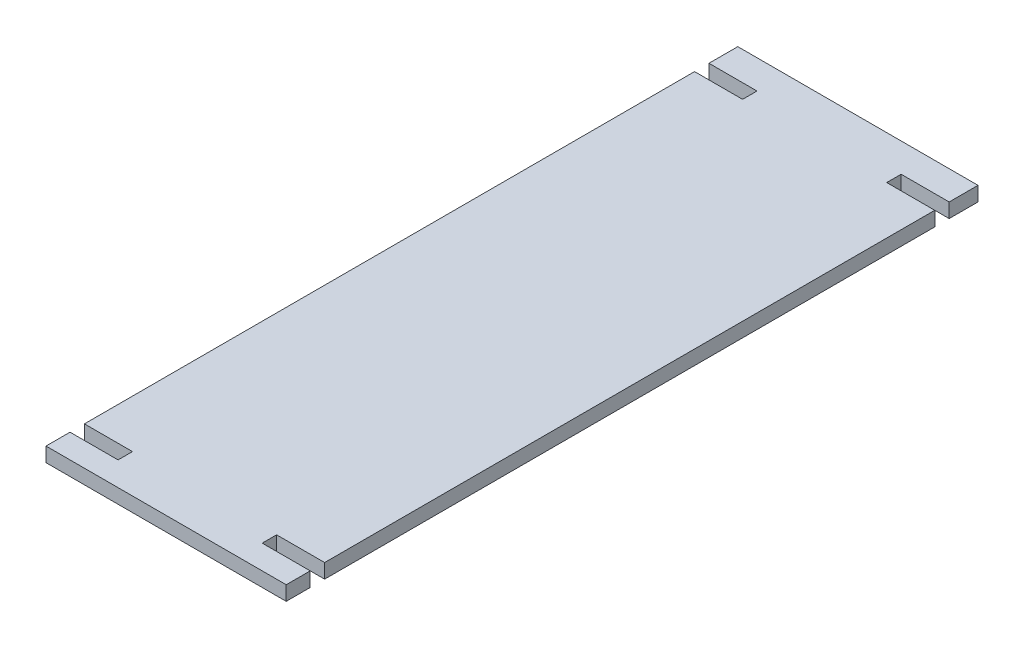
ISO-10303-21;
HEADER;
FILE_DESCRIPTION(('STEP AP214'),'2;1');
FILE_NAME('part.step','',(''),(''),'','','');
FILE_SCHEMA(('AUTOMOTIVE_DESIGN { 1 0 10303 214 1 1 1 1 }'));
ENDSEC;
DATA;
#1=APPLICATION_CONTEXT('core data for automotive mechanical design processes');
#2=APPLICATION_PROTOCOL_DEFINITION('international standard','automotive_design',2000,#1);
#3=PRODUCT_CONTEXT('',#1,'mechanical');
#4=PRODUCT('Part','Part','',(#3));
#5=PRODUCT_RELATED_PRODUCT_CATEGORY('part','',(#4));
#6=PRODUCT_DEFINITION_FORMATION('','',#4);
#7=PRODUCT_DEFINITION_CONTEXT('part definition',#1,'design');
#8=PRODUCT_DEFINITION('design','',#6,#7);
#9=PRODUCT_DEFINITION_SHAPE('','',#8);
#10=(LENGTH_UNIT() NAMED_UNIT(*) SI_UNIT(.MILLI.,.METRE.));
#11=(NAMED_UNIT(*) PLANE_ANGLE_UNIT() SI_UNIT($,.RADIAN.));
#12=(NAMED_UNIT(*) SI_UNIT($,.STERADIAN.) SOLID_ANGLE_UNIT());
#13=UNCERTAINTY_MEASURE_WITH_UNIT(LENGTH_MEASURE(1.E-05),#10,'distance_accuracy_value','');
#14=(GEOMETRIC_REPRESENTATION_CONTEXT(3) GLOBAL_UNCERTAINTY_ASSIGNED_CONTEXT((#13)) GLOBAL_UNIT_ASSIGNED_CONTEXT((#10,
#11,#12)) REPRESENTATION_CONTEXT('',''));
#15=CARTESIAN_POINT('',(0.,0.,0.));
#16=DIRECTION('',(0.,0.,1.));
#17=DIRECTION('',(1.,0.,0.));
#18=AXIS2_PLACEMENT_3D('',#15,#16,#17);
#19=CARTESIAN_POINT('',(0.,6.,0.));
#20=DIRECTION('',(-1.,0.,0.));
#21=DIRECTION('',(0.,0.,1.));
#22=AXIS2_PLACEMENT_3D('',#19,#20,#21);
#23=PLANE('',#22);
#24=DIRECTION('',(0.,0.,-1.));
#25=VECTOR('',#24,1.);
#26=CARTESIAN_POINT('',(0.,6.,0.));
#27=LINE('',#26,#25);
#28=CARTESIAN_POINT('',(0.,6.,-276.));
#29=VERTEX_POINT('',#28);
#30=CARTESIAN_POINT('',(0.,6.,-288.));
#31=VERTEX_POINT('',#30);
#32=EDGE_CURVE('E339',#29,#31,#27,.T.);
#33=ORIENTED_EDGE('',*,*,#32,.F.);
#34=DIRECTION('',(0.,1.,0.));
#35=VECTOR('',#34,1.);
#36=CARTESIAN_POINT('',(0.,0.,-276.));
#37=LINE('',#36,#35);
#38=CARTESIAN_POINT('',(0.,0.,-276.));
#39=VERTEX_POINT('',#38);
#40=EDGE_CURVE('E223',#39,#29,#37,.T.);
#41=ORIENTED_EDGE('',*,*,#40,.F.);
#42=DIRECTION('',(0.,0.,-1.));
#43=VECTOR('',#42,1.);
#44=CARTESIAN_POINT('',(0.,0.,0.));
#45=LINE('',#44,#43);
#46=CARTESIAN_POINT('',(0.,0.,-288.));
#47=VERTEX_POINT('',#46);
#48=EDGE_CURVE('E324',#39,#47,#45,.T.);
#49=ORIENTED_EDGE('',*,*,#48,.T.);
#50=DIRECTION('',(0.,-1.,0.));
#51=VECTOR('',#50,1.);
#52=CARTESIAN_POINT('',(0.,6.,-288.));
#53=LINE('',#52,#51);
#54=EDGE_CURVE('E11',#31,#47,#53,.T.);
#55=ORIENTED_EDGE('',*,*,#54,.F.);
#56=EDGE_LOOP('',(#33,#41,#49,#55));
#57=FACE_BOUND('',#56,.T.);
#58=ADVANCED_FACE('F45',(#57),#23,.F.);
#59=CARTESIAN_POINT('',(0.,0.,-16.));
#60=VERTEX_POINT('',#59);
#61=CARTESIAN_POINT('',(0.,0.,-270.));
#62=VERTEX_POINT('',#61);
#63=EDGE_CURVE('E357',#60,#62,#45,.T.);
#64=ORIENTED_EDGE('',*,*,#63,.T.);
#65=DIRECTION('',(0.,1.,0.));
#66=VECTOR('',#65,1.);
#67=CARTESIAN_POINT('',(0.,0.,-270.));
#68=LINE('',#67,#66);
#69=CARTESIAN_POINT('',(0.,6.,-270.));
#70=VERTEX_POINT('',#69);
#71=EDGE_CURVE('E69',#62,#70,#68,.T.);
#72=ORIENTED_EDGE('',*,*,#71,.T.);
#73=CARTESIAN_POINT('',(0.,6.,-16.));
#74=VERTEX_POINT('',#73);
#75=EDGE_CURVE('E338',#74,#70,#27,.T.);
#76=ORIENTED_EDGE('',*,*,#75,.F.);
#77=DIRECTION('',(0.,1.,0.));
#78=VECTOR('',#77,1.);
#79=CARTESIAN_POINT('',(0.,0.,-16.));
#80=LINE('',#79,#78);
#81=EDGE_CURVE('E288',#60,#74,#80,.T.);
#82=ORIENTED_EDGE('',*,*,#81,.F.);
#83=EDGE_LOOP('',(#64,#72,#76,#82));
#84=FACE_BOUND('',#83,.T.);
#85=ADVANCED_FACE('F402',(#84),#23,.F.);
#86=CARTESIAN_POINT('',(-100.,6.,0.));
#87=DIRECTION('',(1.,0.,0.));
#88=DIRECTION('',(0.,0.,-1.));
#89=AXIS2_PLACEMENT_3D('',#86,#87,#88);
#90=PLANE('',#89);
#91=DIRECTION('',(0.,0.,1.));
#92=VECTOR('',#91,1.);
#93=CARTESIAN_POINT('',(-100.,0.,0.));
#94=LINE('',#93,#92);
#95=CARTESIAN_POINT('',(-100.,0.,-270.));
#96=VERTEX_POINT('',#95);
#97=CARTESIAN_POINT('',(-100.,0.,-16.));
#98=VERTEX_POINT('',#97);
#99=EDGE_CURVE('E366',#96,#98,#94,.T.);
#100=ORIENTED_EDGE('',*,*,#99,.T.);
#101=DIRECTION('',(0.,1.,0.));
#102=VECTOR('',#101,1.);
#103=CARTESIAN_POINT('',(-100.,0.,-16.));
#104=LINE('',#103,#102);
#105=CARTESIAN_POINT('',(-100.,6.,-16.));
#106=VERTEX_POINT('',#105);
#107=EDGE_CURVE('E216',#98,#106,#104,.T.);
#108=ORIENTED_EDGE('',*,*,#107,.T.);
#109=DIRECTION('',(0.,0.,1.));
#110=VECTOR('',#109,1.);
#111=CARTESIAN_POINT('',(-100.,6.,0.));
#112=LINE('',#111,#110);
#113=CARTESIAN_POINT('',(-100.,6.,-270.));
#114=VERTEX_POINT('',#113);
#115=EDGE_CURVE('E348',#114,#106,#112,.T.);
#116=ORIENTED_EDGE('',*,*,#115,.F.);
#117=DIRECTION('',(0.,1.,0.));
#118=VECTOR('',#117,1.);
#119=CARTESIAN_POINT('',(-100.,0.,-270.));
#120=LINE('',#119,#118);
#121=EDGE_CURVE('E310',#96,#114,#120,.T.);
#122=ORIENTED_EDGE('',*,*,#121,.F.);
#123=EDGE_LOOP('',(#100,#108,#116,#122));
#124=FACE_BOUND('',#123,.T.);
#125=ADVANCED_FACE('F434',(#124),#90,.F.);
#126=CARTESIAN_POINT('',(-100.,0.,-288.));
#127=VERTEX_POINT('',#126);
#128=CARTESIAN_POINT('',(-100.,0.,-276.));
#129=VERTEX_POINT('',#128);
#130=EDGE_CURVE('E361',#127,#129,#94,.T.);
#131=ORIENTED_EDGE('',*,*,#130,.T.);
#132=DIRECTION('',(0.,1.,0.));
#133=VECTOR('',#132,1.);
#134=CARTESIAN_POINT('',(-100.,0.,-276.));
#135=LINE('',#134,#133);
#136=CARTESIAN_POINT('',(-100.,6.,-276.));
#137=VERTEX_POINT('',#136);
#138=EDGE_CURVE('E320',#129,#137,#135,.T.);
#139=ORIENTED_EDGE('',*,*,#138,.T.);
#140=CARTESIAN_POINT('',(-100.,6.,-288.));
#141=VERTEX_POINT('',#140);
#142=EDGE_CURVE('E343',#141,#137,#112,.T.);
#143=ORIENTED_EDGE('',*,*,#142,.F.);
#144=DIRECTION('',(0.,-1.,0.));
#145=VECTOR('',#144,1.);
#146=CARTESIAN_POINT('',(-100.,6.,-288.));
#147=LINE('',#146,#145);
#148=EDGE_CURVE('E54',#141,#127,#147,.T.);
#149=ORIENTED_EDGE('',*,*,#148,.T.);
#150=EDGE_LOOP('',(#131,#139,#143,#149));
#151=FACE_BOUND('',#150,.T.);
#152=ADVANCED_FACE('F381',(#151),#90,.F.);
#153=CARTESIAN_POINT('',(0.,0.,0.));
#154=VERTEX_POINT('',#153);
#155=CARTESIAN_POINT('',(0.,0.,-9.99999999999995));
#156=VERTEX_POINT('',#155);
#157=EDGE_CURVE('E352',#154,#156,#45,.T.);
#158=ORIENTED_EDGE('',*,*,#157,.T.);
#159=DIRECTION('',(0.,1.,0.));
#160=VECTOR('',#159,1.);
#161=CARTESIAN_POINT('',(0.,0.,-9.99999999999995));
#162=LINE('',#161,#160);
#163=CARTESIAN_POINT('',(0.,6.,-9.99999999999995));
#164=VERTEX_POINT('',#163);
#165=EDGE_CURVE('E291',#156,#164,#162,.T.);
#166=ORIENTED_EDGE('',*,*,#165,.T.);
#167=CARTESIAN_POINT('',(0.,6.,0.));
#168=VERTEX_POINT('',#167);
#169=EDGE_CURVE('E333',#168,#164,#27,.T.);
#170=ORIENTED_EDGE('',*,*,#169,.F.);
#171=DIRECTION('',(0.,-1.,0.));
#172=VECTOR('',#171,1.);
#173=CARTESIAN_POINT('',(0.,6.,0.));
#174=LINE('',#173,#172);
#175=EDGE_CURVE('E351',#168,#154,#174,.T.);
#176=ORIENTED_EDGE('',*,*,#175,.T.);
#177=EDGE_LOOP('',(#158,#166,#170,#176));
#178=FACE_BOUND('',#177,.T.);
#179=ADVANCED_FACE('F47',(#178),#23,.F.);
#180=CARTESIAN_POINT('',(0.,6.,-288.));
#181=DIRECTION('',(0.,0.,1.));
#182=DIRECTION('',(1.,0.,0.));
#183=AXIS2_PLACEMENT_3D('',#180,#181,#182);
#184=PLANE('',#183);
#185=DIRECTION('',(-1.,0.,0.));
#186=VECTOR('',#185,1.);
#187=CARTESIAN_POINT('',(0.,0.,-288.));
#188=LINE('',#187,#186);
#189=EDGE_CURVE('E356',#47,#127,#188,.T.);
#190=ORIENTED_EDGE('',*,*,#189,.T.);
#191=ORIENTED_EDGE('',*,*,#148,.F.);
#192=DIRECTION('',(-1.,0.,0.));
#193=VECTOR('',#192,1.);
#194=CARTESIAN_POINT('',(0.,6.,-288.));
#195=LINE('',#194,#193);
#196=EDGE_CURVE('E337',#31,#141,#195,.T.);
#197=ORIENTED_EDGE('',*,*,#196,.F.);
#198=ORIENTED_EDGE('',*,*,#54,.T.);
#199=EDGE_LOOP('',(#190,#191,#197,#198));
#200=FACE_BOUND('',#199,.T.);
#201=ADVANCED_FACE('F395',(#200),#184,.F.);
#202=CARTESIAN_POINT('',(-100.,6.,-9.99999999999995));
#203=VERTEX_POINT('',#202);
#204=CARTESIAN_POINT('',(-100.,6.,0.));
#205=VERTEX_POINT('',#204);
#206=EDGE_CURVE('E342',#203,#205,#112,.T.);
#207=ORIENTED_EDGE('',*,*,#206,.F.);
#208=DIRECTION('',(0.,1.,0.));
#209=VECTOR('',#208,1.);
#210=CARTESIAN_POINT('',(-100.,0.,-9.99999999999995));
#211=LINE('',#210,#209);
#212=CARTESIAN_POINT('',(-100.,0.,-9.99999999999995));
#213=VERTEX_POINT('',#212);
#214=EDGE_CURVE('E239',#213,#203,#211,.T.);
#215=ORIENTED_EDGE('',*,*,#214,.F.);
#216=CARTESIAN_POINT('',(-100.,0.,0.));
#217=VERTEX_POINT('',#216);
#218=EDGE_CURVE('E360',#213,#217,#94,.T.);
#219=ORIENTED_EDGE('',*,*,#218,.T.);
#220=DIRECTION('',(0.,-1.,0.));
#221=VECTOR('',#220,1.);
#222=CARTESIAN_POINT('',(-100.,6.,0.));
#223=LINE('',#222,#221);
#224=EDGE_CURVE('E372',#205,#217,#223,.T.);
#225=ORIENTED_EDGE('',*,*,#224,.F.);
#226=EDGE_LOOP('',(#207,#215,#219,#225));
#227=FACE_BOUND('',#226,.T.);
#228=ADVANCED_FACE('F447',(#227),#90,.F.);
#229=CARTESIAN_POINT('',(0.,6.,0.));
#230=DIRECTION('',(0.,0.,-1.));
#231=DIRECTION('',(-1.,0.,0.));
#232=AXIS2_PLACEMENT_3D('',#229,#230,#231);
#233=PLANE('',#232);
#234=DIRECTION('',(1.,0.,0.));
#235=VECTOR('',#234,1.);
#236=CARTESIAN_POINT('',(0.,0.,0.));
#237=LINE('',#236,#235);
#238=EDGE_CURVE('E365',#217,#154,#237,.T.);
#239=ORIENTED_EDGE('',*,*,#238,.T.);
#240=ORIENTED_EDGE('',*,*,#175,.F.);
#241=DIRECTION('',(1.,0.,0.));
#242=VECTOR('',#241,1.);
#243=CARTESIAN_POINT('',(0.,6.,0.));
#244=LINE('',#243,#242);
#245=EDGE_CURVE('E347',#205,#168,#244,.T.);
#246=ORIENTED_EDGE('',*,*,#245,.F.);
#247=ORIENTED_EDGE('',*,*,#224,.T.);
#248=EDGE_LOOP('',(#239,#240,#246,#247));
#249=FACE_BOUND('',#248,.T.);
#250=ADVANCED_FACE('F423',(#249),#233,.F.);
#251=CARTESIAN_POINT('',(0.,6.,0.));
#252=DIRECTION('',(0.,1.,0.));
#253=DIRECTION('',(0.,0.,1.));
#254=AXIS2_PLACEMENT_3D('',#251,#252,#253);
#255=PLANE('',#254);
#256=DIRECTION('',(-1.,0.,0.));
#257=VECTOR('',#256,1.);
#258=CARTESIAN_POINT('',(-20.,6.,-276.));
#259=LINE('',#258,#257);
#260=CARTESIAN_POINT('',(-20.,6.,-276.));
#261=VERTEX_POINT('',#260);
#262=EDGE_CURVE('E205',#29,#261,#259,.T.);
#263=ORIENTED_EDGE('',*,*,#262,.F.);
#264=ORIENTED_EDGE('',*,*,#32,.T.);
#265=ORIENTED_EDGE('',*,*,#196,.T.);
#266=ORIENTED_EDGE('',*,*,#142,.T.);
#267=DIRECTION('',(-1.,0.,0.));
#268=VECTOR('',#267,1.);
#269=CARTESIAN_POINT('',(-100.,6.,-276.));
#270=LINE('',#269,#268);
#271=CARTESIAN_POINT('',(-80.,6.,-276.));
#272=VERTEX_POINT('',#271);
#273=EDGE_CURVE('E302',#272,#137,#270,.T.);
#274=ORIENTED_EDGE('',*,*,#273,.F.);
#275=DIRECTION('',(0.,0.,-1.));
#276=VECTOR('',#275,1.);
#277=CARTESIAN_POINT('',(-80.,6.,-276.));
#278=LINE('',#277,#276);
#279=CARTESIAN_POINT('',(-80.,6.,-270.));
#280=VERTEX_POINT('',#279);
#281=EDGE_CURVE('E314',#280,#272,#278,.T.);
#282=ORIENTED_EDGE('',*,*,#281,.F.);
#283=DIRECTION('',(1.,0.,0.));
#284=VECTOR('',#283,1.);
#285=CARTESIAN_POINT('',(-100.,6.,-270.));
#286=LINE('',#285,#284);
#287=EDGE_CURVE('E222',#114,#280,#286,.T.);
#288=ORIENTED_EDGE('',*,*,#287,.F.);
#289=ORIENTED_EDGE('',*,*,#115,.T.);
#290=DIRECTION('',(-1.,0.,0.));
#291=VECTOR('',#290,1.);
#292=CARTESIAN_POINT('',(-100.,6.,-16.));
#293=LINE('',#292,#291);
#294=CARTESIAN_POINT('',(-80.,6.,-16.));
#295=VERTEX_POINT('',#294);
#296=EDGE_CURVE('E232',#295,#106,#293,.T.);
#297=ORIENTED_EDGE('',*,*,#296,.F.);
#298=DIRECTION('',(0.,0.,-1.));
#299=VECTOR('',#298,1.);
#300=CARTESIAN_POINT('',(-80.,6.,-16.));
#301=LINE('',#300,#299);
#302=CARTESIAN_POINT('',(-80.,6.,-9.99999999999995));
#303=VERTEX_POINT('',#302);
#304=EDGE_CURVE('E244',#303,#295,#301,.T.);
#305=ORIENTED_EDGE('',*,*,#304,.F.);
#306=DIRECTION('',(1.,0.,0.));
#307=VECTOR('',#306,1.);
#308=CARTESIAN_POINT('',(-100.,6.,-9.99999999999995));
#309=LINE('',#308,#307);
#310=EDGE_CURVE('E240',#203,#303,#309,.T.);
#311=ORIENTED_EDGE('',*,*,#310,.F.);
#312=ORIENTED_EDGE('',*,*,#206,.T.);
#313=ORIENTED_EDGE('',*,*,#245,.T.);
#314=ORIENTED_EDGE('',*,*,#169,.T.);
#315=DIRECTION('',(1.,0.,0.));
#316=VECTOR('',#315,1.);
#317=CARTESIAN_POINT('',(-20.,6.,-9.99999999999995));
#318=LINE('',#317,#316);
#319=CARTESIAN_POINT('',(-20.,6.,-9.99999999999995));
#320=VERTEX_POINT('',#319);
#321=EDGE_CURVE('E280',#320,#164,#318,.T.);
#322=ORIENTED_EDGE('',*,*,#321,.F.);
#323=DIRECTION('',(0.,0.,1.));
#324=VECTOR('',#323,1.);
#325=CARTESIAN_POINT('',(-20.,6.,-16.));
#326=LINE('',#325,#324);
#327=CARTESIAN_POINT('',(-20.,6.,-16.));
#328=VERTEX_POINT('',#327);
#329=EDGE_CURVE('E276',#328,#320,#326,.T.);
#330=ORIENTED_EDGE('',*,*,#329,.F.);
#331=DIRECTION('',(-1.,0.,0.));
#332=VECTOR('',#331,1.);
#333=CARTESIAN_POINT('',(-20.,6.,-16.));
#334=LINE('',#333,#332);
#335=EDGE_CURVE('E267',#74,#328,#334,.T.);
#336=ORIENTED_EDGE('',*,*,#335,.F.);
#337=ORIENTED_EDGE('',*,*,#75,.T.);
#338=DIRECTION('',(1.,0.,0.));
#339=VECTOR('',#338,1.);
#340=CARTESIAN_POINT('',(-20.,6.,-270.));
#341=LINE('',#340,#339);
#342=CARTESIAN_POINT('',(-20.,6.,-270.));
#343=VERTEX_POINT('',#342);
#344=EDGE_CURVE('E209',#343,#70,#341,.T.);
#345=ORIENTED_EDGE('',*,*,#344,.F.);
#346=DIRECTION('',(0.,0.,1.));
#347=VECTOR('',#346,1.);
#348=CARTESIAN_POINT('',(-20.,6.,-276.));
#349=LINE('',#348,#347);
#350=EDGE_CURVE('E190',#261,#343,#349,.T.);
#351=ORIENTED_EDGE('',*,*,#350,.F.);
#352=EDGE_LOOP('',(#263,#264,#265,#266,#274,#282,#288,#289,#297,#305,#311,#312,#313,#314,#322,
#330,#336,#337,#345,#351));
#353=FACE_BOUND('',#352,.T.);
#354=ADVANCED_FACE('F391',(#353),#255,.T.);
#355=CARTESIAN_POINT('',(0.,0.,0.));
#356=DIRECTION('',(0.,1.,0.));
#357=DIRECTION('',(0.,0.,1.));
#358=AXIS2_PLACEMENT_3D('',#355,#356,#357);
#359=PLANE('',#358);
#360=ORIENTED_EDGE('',*,*,#48,.F.);
#361=DIRECTION('',(-1.,0.,0.));
#362=VECTOR('',#361,1.);
#363=CARTESIAN_POINT('',(-20.,0.,-276.));
#364=LINE('',#363,#362);
#365=CARTESIAN_POINT('',(-20.,0.,-276.));
#366=VERTEX_POINT('',#365);
#367=EDGE_CURVE('E193',#39,#366,#364,.T.);
#368=ORIENTED_EDGE('',*,*,#367,.T.);
#369=DIRECTION('',(0.,0.,1.));
#370=VECTOR('',#369,1.);
#371=CARTESIAN_POINT('',(-20.,0.,-276.));
#372=LINE('',#371,#370);
#373=CARTESIAN_POINT('',(-20.,0.,-270.));
#374=VERTEX_POINT('',#373);
#375=EDGE_CURVE('E187',#366,#374,#372,.T.);
#376=ORIENTED_EDGE('',*,*,#375,.T.);
#377=DIRECTION('',(1.,0.,0.));
#378=VECTOR('',#377,1.);
#379=CARTESIAN_POINT('',(-20.,0.,-270.));
#380=LINE('',#379,#378);
#381=EDGE_CURVE('E195',#374,#62,#380,.T.);
#382=ORIENTED_EDGE('',*,*,#381,.T.);
#383=ORIENTED_EDGE('',*,*,#63,.F.);
#384=DIRECTION('',(-1.,0.,0.));
#385=VECTOR('',#384,1.);
#386=CARTESIAN_POINT('',(-20.,0.,-16.));
#387=LINE('',#386,#385);
#388=CARTESIAN_POINT('',(-20.,0.,-16.));
#389=VERTEX_POINT('',#388);
#390=EDGE_CURVE('E271',#60,#389,#387,.T.);
#391=ORIENTED_EDGE('',*,*,#390,.T.);
#392=DIRECTION('',(0.,0.,1.));
#393=VECTOR('',#392,1.);
#394=CARTESIAN_POINT('',(-20.,0.,-16.));
#395=LINE('',#394,#393);
#396=CARTESIAN_POINT('',(-20.,0.,-9.99999999999995));
#397=VERTEX_POINT('',#396);
#398=EDGE_CURVE('E262',#389,#397,#395,.T.);
#399=ORIENTED_EDGE('',*,*,#398,.T.);
#400=DIRECTION('',(1.,0.,0.));
#401=VECTOR('',#400,1.);
#402=CARTESIAN_POINT('',(-20.,0.,-9.99999999999995));
#403=LINE('',#402,#401);
#404=EDGE_CURVE('E266',#397,#156,#403,.T.);
#405=ORIENTED_EDGE('',*,*,#404,.T.);
#406=ORIENTED_EDGE('',*,*,#157,.F.);
#407=ORIENTED_EDGE('',*,*,#238,.F.);
#408=ORIENTED_EDGE('',*,*,#218,.F.);
#409=DIRECTION('',(1.,0.,0.));
#410=VECTOR('',#409,1.);
#411=CARTESIAN_POINT('',(-100.,0.,-9.99999999999995));
#412=LINE('',#411,#410);
#413=CARTESIAN_POINT('',(-80.,0.,-9.99999999999995));
#414=VERTEX_POINT('',#413);
#415=EDGE_CURVE('E228',#213,#414,#412,.T.);
#416=ORIENTED_EDGE('',*,*,#415,.T.);
#417=DIRECTION('',(0.,0.,-1.));
#418=VECTOR('',#417,1.);
#419=CARTESIAN_POINT('',(-80.,0.,-16.));
#420=LINE('',#419,#418);
#421=CARTESIAN_POINT('',(-80.,0.,-16.));
#422=VERTEX_POINT('',#421);
#423=EDGE_CURVE('E61',#414,#422,#420,.T.);
#424=ORIENTED_EDGE('',*,*,#423,.T.);
#425=DIRECTION('',(-1.,0.,0.));
#426=VECTOR('',#425,1.);
#427=CARTESIAN_POINT('',(-100.,0.,-16.));
#428=LINE('',#427,#426);
#429=EDGE_CURVE('E235',#422,#98,#428,.T.);
#430=ORIENTED_EDGE('',*,*,#429,.T.);
#431=ORIENTED_EDGE('',*,*,#99,.F.);
#432=DIRECTION('',(1.,0.,0.));
#433=VECTOR('',#432,1.);
#434=CARTESIAN_POINT('',(-100.,0.,-270.));
#435=LINE('',#434,#433);
#436=CARTESIAN_POINT('',(-80.,0.,-270.));
#437=VERTEX_POINT('',#436);
#438=EDGE_CURVE('E297',#96,#437,#435,.T.);
#439=ORIENTED_EDGE('',*,*,#438,.T.);
#440=DIRECTION('',(0.,0.,-1.));
#441=VECTOR('',#440,1.);
#442=CARTESIAN_POINT('',(-80.,0.,-276.));
#443=LINE('',#442,#441);
#444=CARTESIAN_POINT('',(-80.,0.,-276.));
#445=VERTEX_POINT('',#444);
#446=EDGE_CURVE('E301',#437,#445,#443,.T.);
#447=ORIENTED_EDGE('',*,*,#446,.T.);
#448=DIRECTION('',(-1.,0.,0.));
#449=VECTOR('',#448,1.);
#450=CARTESIAN_POINT('',(-100.,0.,-276.));
#451=LINE('',#450,#449);
#452=EDGE_CURVE('E306',#445,#129,#451,.T.);
#453=ORIENTED_EDGE('',*,*,#452,.T.);
#454=ORIENTED_EDGE('',*,*,#130,.F.);
#455=ORIENTED_EDGE('',*,*,#189,.F.);
#456=EDGE_LOOP('',(#360,#368,#376,#382,#383,#391,#399,#405,#406,#407,#408,#416,#424,#430,#431,
#439,#447,#453,#454,#455));
#457=FACE_BOUND('',#456,.T.);
#458=ADVANCED_FACE('F203',(#457),#359,.F.);
#459=CARTESIAN_POINT('',(-100.,0.,-276.));
#460=DIRECTION('',(0.,0.,-1.));
#461=DIRECTION('',(-1.,0.,0.));
#462=AXIS2_PLACEMENT_3D('',#459,#460,#461);
#463=PLANE('',#462);
#464=ORIENTED_EDGE('',*,*,#273,.T.);
#465=ORIENTED_EDGE('',*,*,#138,.F.);
#466=ORIENTED_EDGE('',*,*,#452,.F.);
#467=DIRECTION('',(0.,1.,0.));
#468=VECTOR('',#467,1.);
#469=CARTESIAN_POINT('',(-80.,0.,-276.));
#470=LINE('',#469,#468);
#471=EDGE_CURVE('E325',#445,#272,#470,.T.);
#472=ORIENTED_EDGE('',*,*,#471,.T.);
#473=EDGE_LOOP('',(#464,#465,#466,#472));
#474=FACE_BOUND('',#473,.T.);
#475=ADVANCED_FACE('F387',(#474),#463,.F.);
#476=CARTESIAN_POINT('',(-80.,0.,-276.));
#477=DIRECTION('',(1.,0.,0.));
#478=DIRECTION('',(0.,0.,-1.));
#479=AXIS2_PLACEMENT_3D('',#476,#477,#478);
#480=PLANE('',#479);
#481=ORIENTED_EDGE('',*,*,#281,.T.);
#482=ORIENTED_EDGE('',*,*,#471,.F.);
#483=ORIENTED_EDGE('',*,*,#446,.F.);
#484=DIRECTION('',(0.,1.,0.));
#485=VECTOR('',#484,1.);
#486=CARTESIAN_POINT('',(-80.,0.,-270.));
#487=LINE('',#486,#485);
#488=EDGE_CURVE('E328',#437,#280,#487,.T.);
#489=ORIENTED_EDGE('',*,*,#488,.T.);
#490=EDGE_LOOP('',(#481,#482,#483,#489));
#491=FACE_BOUND('',#490,.T.);
#492=ADVANCED_FACE('F497',(#491),#480,.F.);
#493=CARTESIAN_POINT('',(-100.,0.,-270.));
#494=DIRECTION('',(0.,0.,1.));
#495=DIRECTION('',(1.,0.,0.));
#496=AXIS2_PLACEMENT_3D('',#493,#494,#495);
#497=PLANE('',#496);
#498=ORIENTED_EDGE('',*,*,#287,.T.);
#499=ORIENTED_EDGE('',*,*,#488,.F.);
#500=ORIENTED_EDGE('',*,*,#438,.F.);
#501=ORIENTED_EDGE('',*,*,#121,.T.);
#502=EDGE_LOOP('',(#498,#499,#500,#501));
#503=FACE_BOUND('',#502,.T.);
#504=ADVANCED_FACE('F507',(#503),#497,.F.);
#505=CARTESIAN_POINT('',(-20.,0.,-16.));
#506=DIRECTION('',(-1.,0.,0.));
#507=DIRECTION('',(0.,0.,1.));
#508=AXIS2_PLACEMENT_3D('',#505,#506,#507);
#509=PLANE('',#508);
#510=ORIENTED_EDGE('',*,*,#329,.T.);
#511=DIRECTION('',(0.,1.,0.));
#512=VECTOR('',#511,1.);
#513=CARTESIAN_POINT('',(-20.,0.,-9.99999999999995));
#514=LINE('',#513,#512);
#515=EDGE_CURVE('E275',#397,#320,#514,.T.);
#516=ORIENTED_EDGE('',*,*,#515,.F.);
#517=ORIENTED_EDGE('',*,*,#398,.F.);
#518=DIRECTION('',(0.,1.,0.));
#519=VECTOR('',#518,1.);
#520=CARTESIAN_POINT('',(-20.,0.,-16.));
#521=LINE('',#520,#519);
#522=EDGE_CURVE('E245',#389,#328,#521,.T.);
#523=ORIENTED_EDGE('',*,*,#522,.T.);
#524=EDGE_LOOP('',(#510,#516,#517,#523));
#525=FACE_BOUND('',#524,.T.);
#526=ADVANCED_FACE('F411',(#525),#509,.F.);
#527=CARTESIAN_POINT('',(-20.,0.,-16.));
#528=DIRECTION('',(0.,0.,-1.));
#529=DIRECTION('',(-1.,0.,0.));
#530=AXIS2_PLACEMENT_3D('',#527,#528,#529);
#531=PLANE('',#530);
#532=ORIENTED_EDGE('',*,*,#335,.T.);
#533=ORIENTED_EDGE('',*,*,#522,.F.);
#534=ORIENTED_EDGE('',*,*,#390,.F.);
#535=ORIENTED_EDGE('',*,*,#81,.T.);
#536=EDGE_LOOP('',(#532,#533,#534,#535));
#537=FACE_BOUND('',#536,.T.);
#538=ADVANCED_FACE('F407',(#537),#531,.F.);
#539=CARTESIAN_POINT('',(-20.,0.,-9.99999999999995));
#540=DIRECTION('',(0.,0.,1.));
#541=DIRECTION('',(1.,0.,0.));
#542=AXIS2_PLACEMENT_3D('',#539,#540,#541);
#543=PLANE('',#542);
#544=ORIENTED_EDGE('',*,*,#321,.T.);
#545=ORIENTED_EDGE('',*,*,#165,.F.);
#546=ORIENTED_EDGE('',*,*,#404,.F.);
#547=ORIENTED_EDGE('',*,*,#515,.T.);
#548=EDGE_LOOP('',(#544,#545,#546,#547));
#549=FACE_BOUND('',#548,.T.);
#550=ADVANCED_FACE('F415',(#549),#543,.F.);
#551=CARTESIAN_POINT('',(-100.,0.,-16.));
#552=DIRECTION('',(0.,0.,-1.));
#553=DIRECTION('',(-1.,0.,0.));
#554=AXIS2_PLACEMENT_3D('',#551,#552,#553);
#555=PLANE('',#554);
#556=ORIENTED_EDGE('',*,*,#296,.T.);
#557=ORIENTED_EDGE('',*,*,#107,.F.);
#558=ORIENTED_EDGE('',*,*,#429,.F.);
#559=DIRECTION('',(0.,1.,0.));
#560=VECTOR('',#559,1.);
#561=CARTESIAN_POINT('',(-80.,0.,-16.));
#562=LINE('',#561,#560);
#563=EDGE_CURVE('E254',#422,#295,#562,.T.);
#564=ORIENTED_EDGE('',*,*,#563,.T.);
#565=EDGE_LOOP('',(#556,#557,#558,#564));
#566=FACE_BOUND('',#565,.T.);
#567=ADVANCED_FACE('F439',(#566),#555,.F.);
#568=CARTESIAN_POINT('',(-80.,0.,-16.));
#569=DIRECTION('',(1.,0.,0.));
#570=DIRECTION('',(0.,0.,-1.));
#571=AXIS2_PLACEMENT_3D('',#568,#569,#570);
#572=PLANE('',#571);
#573=ORIENTED_EDGE('',*,*,#304,.T.);
#574=ORIENTED_EDGE('',*,*,#563,.F.);
#575=ORIENTED_EDGE('',*,*,#423,.F.);
#576=DIRECTION('',(0.,1.,0.));
#577=VECTOR('',#576,1.);
#578=CARTESIAN_POINT('',(-80.,0.,-9.99999999999995));
#579=LINE('',#578,#577);
#580=EDGE_CURVE('E257',#414,#303,#579,.T.);
#581=ORIENTED_EDGE('',*,*,#580,.T.);
#582=EDGE_LOOP('',(#573,#574,#575,#581));
#583=FACE_BOUND('',#582,.T.);
#584=ADVANCED_FACE('F576',(#583),#572,.F.);
#585=CARTESIAN_POINT('',(-100.,0.,-9.99999999999995));
#586=DIRECTION('',(0.,0.,1.));
#587=DIRECTION('',(1.,0.,0.));
#588=AXIS2_PLACEMENT_3D('',#585,#586,#587);
#589=PLANE('',#588);
#590=ORIENTED_EDGE('',*,*,#310,.T.);
#591=ORIENTED_EDGE('',*,*,#580,.F.);
#592=ORIENTED_EDGE('',*,*,#415,.F.);
#593=ORIENTED_EDGE('',*,*,#214,.T.);
#594=EDGE_LOOP('',(#590,#591,#592,#593));
#595=FACE_BOUND('',#594,.T.);
#596=ADVANCED_FACE('F585',(#595),#589,.F.);
#597=CARTESIAN_POINT('',(-20.,0.,-276.));
#598=DIRECTION('',(-1.,0.,0.));
#599=DIRECTION('',(0.,0.,1.));
#600=AXIS2_PLACEMENT_3D('',#597,#598,#599);
#601=PLANE('',#600);
#602=ORIENTED_EDGE('',*,*,#350,.T.);
#603=DIRECTION('',(0.,1.,0.));
#604=VECTOR('',#603,1.);
#605=CARTESIAN_POINT('',(-20.,0.,-270.));
#606=LINE('',#605,#604);
#607=EDGE_CURVE('E184',#374,#343,#606,.T.);
#608=ORIENTED_EDGE('',*,*,#607,.F.);
#609=ORIENTED_EDGE('',*,*,#375,.F.);
#610=DIRECTION('',(0.,1.,0.));
#611=VECTOR('',#610,1.);
#612=CARTESIAN_POINT('',(-20.,0.,-276.));
#613=LINE('',#612,#611);
#614=EDGE_CURVE('E219',#366,#261,#613,.T.);
#615=ORIENTED_EDGE('',*,*,#614,.T.);
#616=EDGE_LOOP('',(#602,#608,#609,#615));
#617=FACE_BOUND('',#616,.T.);
#618=ADVANCED_FACE('F185',(#617),#601,.F.);
#619=CARTESIAN_POINT('',(-20.,0.,-276.));
#620=DIRECTION('',(0.,0.,-1.));
#621=DIRECTION('',(-1.,0.,0.));
#622=AXIS2_PLACEMENT_3D('',#619,#620,#621);
#623=PLANE('',#622);
#624=ORIENTED_EDGE('',*,*,#262,.T.);
#625=ORIENTED_EDGE('',*,*,#614,.F.);
#626=ORIENTED_EDGE('',*,*,#367,.F.);
#627=ORIENTED_EDGE('',*,*,#40,.T.);
#628=EDGE_LOOP('',(#624,#625,#626,#627));
#629=FACE_BOUND('',#628,.T.);
#630=ADVANCED_FACE('F603',(#629),#623,.F.);
#631=CARTESIAN_POINT('',(-20.,0.,-270.));
#632=DIRECTION('',(0.,0.,1.));
#633=DIRECTION('',(1.,0.,0.));
#634=AXIS2_PLACEMENT_3D('',#631,#632,#633);
#635=PLANE('',#634);
#636=ORIENTED_EDGE('',*,*,#344,.T.);
#637=ORIENTED_EDGE('',*,*,#71,.F.);
#638=ORIENTED_EDGE('',*,*,#381,.F.);
#639=ORIENTED_EDGE('',*,*,#607,.T.);
#640=EDGE_LOOP('',(#636,#637,#638,#639));
#641=FACE_BOUND('',#640,.T.);
#642=ADVANCED_FACE('F196',(#641),#635,.F.);
#643=CLOSED_SHELL('',(#58,#85,#125,#152,#179,#201,#228,#250,#354,#458,#475,#492,#504,#526,#538,
#550,#567,#584,#596,#618,#630,#642));
#644=MANIFOLD_SOLID_BREP('B2',#643);
#645=ADVANCED_BREP_SHAPE_REPRESENTATION('',(#18,#644),#14);
#646=SHAPE_DEFINITION_REPRESENTATION(#9,#645);
ENDSEC;
END-ISO-10303-21;
